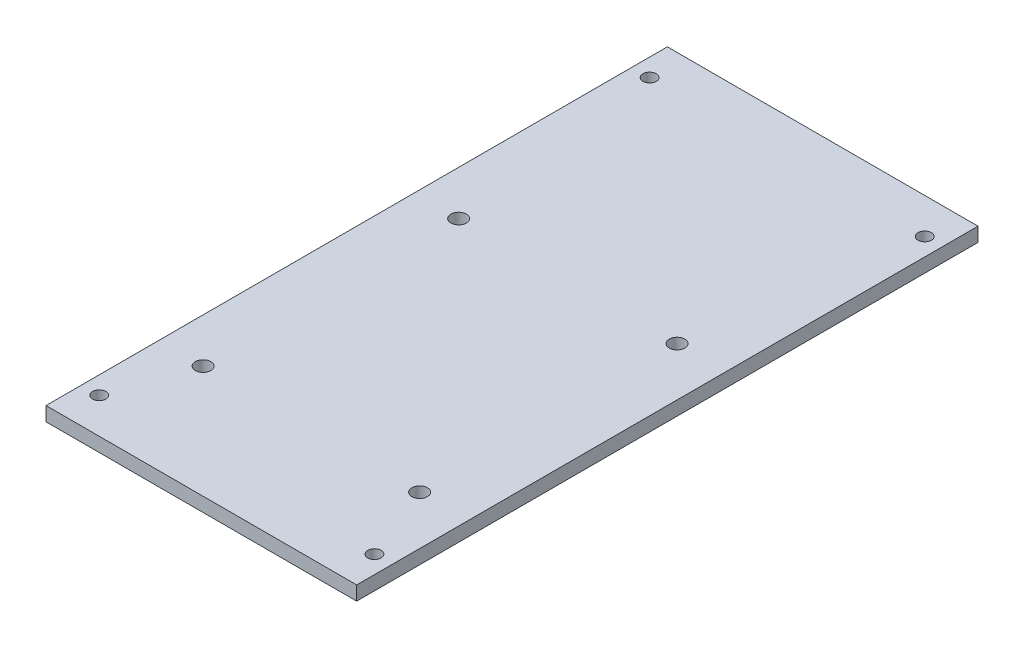
ISO-10303-21;
HEADER;
FILE_DESCRIPTION(('STEP AP214'),'2;1');
FILE_NAME('part.step','',(''),(''),'','','');
FILE_SCHEMA(('AUTOMOTIVE_DESIGN { 1 0 10303 214 1 1 1 1 }'));
ENDSEC;
DATA;
#1=APPLICATION_CONTEXT('core data for automotive mechanical design processes');
#2=APPLICATION_PROTOCOL_DEFINITION('international standard','automotive_design',2000,#1);
#3=PRODUCT_CONTEXT('',#1,'mechanical');
#4=PRODUCT('Part','Part','',(#3));
#5=PRODUCT_RELATED_PRODUCT_CATEGORY('part','',(#4));
#6=PRODUCT_DEFINITION_FORMATION('','',#4);
#7=PRODUCT_DEFINITION_CONTEXT('part definition',#1,'design');
#8=PRODUCT_DEFINITION('design','',#6,#7);
#9=PRODUCT_DEFINITION_SHAPE('','',#8);
#10=(LENGTH_UNIT() NAMED_UNIT(*) SI_UNIT(.MILLI.,.METRE.));
#11=(NAMED_UNIT(*) PLANE_ANGLE_UNIT() SI_UNIT($,.RADIAN.));
#12=(NAMED_UNIT(*) SI_UNIT($,.STERADIAN.) SOLID_ANGLE_UNIT());
#13=UNCERTAINTY_MEASURE_WITH_UNIT(LENGTH_MEASURE(1.E-05),#10,'distance_accuracy_value','');
#14=(GEOMETRIC_REPRESENTATION_CONTEXT(3) GLOBAL_UNCERTAINTY_ASSIGNED_CONTEXT((#13)) GLOBAL_UNIT_ASSIGNED_CONTEXT((#10,
#11,#12)) REPRESENTATION_CONTEXT('',''));
#15=CARTESIAN_POINT('',(0.,0.,0.));
#16=DIRECTION('',(0.,0.,1.));
#17=DIRECTION('',(1.,0.,0.));
#18=AXIS2_PLACEMENT_3D('',#15,#16,#17);
#19=CARTESIAN_POINT('',(0.,3.175,0.));
#20=DIRECTION('',(0.,1.,0.));
#21=DIRECTION('',(0.,0.,1.));
#22=AXIS2_PLACEMENT_3D('',#19,#20,#21);
#23=PLANE('',#22);
#24=CARTESIAN_POINT('',(-24.999549752776,3.175,-12.9798856097353));
#25=DIRECTION('',(0.,1.,0.));
#26=DIRECTION('',(0.,0.,-1.));
#27=AXIS2_PLACEMENT_3D('',#24,#25,#26);
#28=CIRCLE('',#27,1.75);
#29=CARTESIAN_POINT('',(-24.999549752776,3.175,-14.7298856097353));
#30=VERTEX_POINT('',#29);
#31=EDGE_CURVE('E154',#30,#30,#28,.T.);
#32=ORIENTED_EDGE('',*,*,#31,.F.);
#33=EDGE_LOOP('',(#32));
#34=FACE_BOUND('',#33,.T.);
#35=CARTESIAN_POINT('',(24.,3.175,-13.1899428048677));
#36=DIRECTION('',(0.,1.,0.));
#37=DIRECTION('',(0.,0.,-1.));
#38=AXIS2_PLACEMENT_3D('',#35,#36,#37);
#39=CIRCLE('',#38,1.75);
#40=CARTESIAN_POINT('',(24.,3.175,-14.9399428048677));
#41=VERTEX_POINT('',#40);
#42=EDGE_CURVE('E148',#41,#41,#39,.T.);
#43=ORIENTED_EDGE('',*,*,#42,.F.);
#44=EDGE_LOOP('',(#43));
#45=FACE_BOUND('',#44,.T.);
#46=CARTESIAN_POINT('',(24.,3.175,44.8100571951323));
#47=DIRECTION('',(0.,1.,0.));
#48=DIRECTION('',(0.,0.,1.));
#49=AXIS2_PLACEMENT_3D('',#46,#47,#48);
#50=CIRCLE('',#49,1.75);
#51=CARTESIAN_POINT('',(24.,3.175,46.5600571951323));
#52=VERTEX_POINT('',#51);
#53=EDGE_CURVE('E142',#52,#52,#50,.T.);
#54=ORIENTED_EDGE('',*,*,#53,.F.);
#55=EDGE_LOOP('',(#54));
#56=FACE_BOUND('',#55,.T.);
#57=CARTESIAN_POINT('',(-24.999549752776,3.175,44.6));
#58=DIRECTION('',(0.,1.,0.));
#59=DIRECTION('',(0.,0.,1.));
#60=AXIS2_PLACEMENT_3D('',#57,#58,#59);
#61=CIRCLE('',#60,1.75);
#62=CARTESIAN_POINT('',(-24.999549752776,3.175,46.35));
#63=VERTEX_POINT('',#62);
#64=EDGE_CURVE('E136',#63,#63,#61,.T.);
#65=ORIENTED_EDGE('',*,*,#64,.F.);
#66=EDGE_LOOP('',(#65));
#67=FACE_BOUND('',#66,.T.);
#68=CARTESIAN_POINT('',(-31.,3.175,-62.));
#69=DIRECTION('',(0.,1.,0.));
#70=DIRECTION('',(0.,0.,1.));
#71=AXIS2_PLACEMENT_3D('',#68,#69,#70);
#72=CIRCLE('',#71,1.5);
#73=CARTESIAN_POINT('',(-31.,3.175,-60.5));
#74=VERTEX_POINT('',#73);
#75=EDGE_CURVE('E121',#74,#74,#72,.T.);
#76=ORIENTED_EDGE('',*,*,#75,.F.);
#77=EDGE_LOOP('',(#76));
#78=FACE_BOUND('',#77,.T.);
#79=CARTESIAN_POINT('',(31.,3.175,62.));
#80=DIRECTION('',(0.,1.,0.));
#81=DIRECTION('',(0.,0.,1.));
#82=AXIS2_PLACEMENT_3D('',#79,#80,#81);
#83=CIRCLE('',#82,1.50000000000001);
#84=CARTESIAN_POINT('',(31.,3.175,63.5));
#85=VERTEX_POINT('',#84);
#86=EDGE_CURVE('E100',#85,#85,#83,.T.);
#87=ORIENTED_EDGE('',*,*,#86,.F.);
#88=EDGE_LOOP('',(#87));
#89=FACE_BOUND('',#88,.T.);
#90=DIRECTION('',(0.,0.,1.));
#91=VECTOR('',#90,1.);
#92=CARTESIAN_POINT('',(-35.,3.175,70.));
#93=LINE('',#92,#91);
#94=CARTESIAN_POINT('',(-35.,3.175,-70.));
#95=VERTEX_POINT('',#94);
#96=CARTESIAN_POINT('',(-35.,3.175,70.));
#97=VERTEX_POINT('',#96);
#98=EDGE_CURVE('E85',#95,#97,#93,.T.);
#99=ORIENTED_EDGE('',*,*,#98,.T.);
#100=DIRECTION('',(1.,0.,0.));
#101=VECTOR('',#100,1.);
#102=CARTESIAN_POINT('',(35.,3.175,70.));
#103=LINE('',#102,#101);
#104=CARTESIAN_POINT('',(35.,3.175,70.));
#105=VERTEX_POINT('',#104);
#106=EDGE_CURVE('E80',#97,#105,#103,.T.);
#107=ORIENTED_EDGE('',*,*,#106,.T.);
#108=DIRECTION('',(0.,0.,-1.));
#109=VECTOR('',#108,1.);
#110=CARTESIAN_POINT('',(35.,3.175,70.));
#111=LINE('',#110,#109);
#112=CARTESIAN_POINT('',(35.,3.175,-70.));
#113=VERTEX_POINT('',#112);
#114=EDGE_CURVE('E83',#105,#113,#111,.T.);
#115=ORIENTED_EDGE('',*,*,#114,.T.);
#116=DIRECTION('',(-1.,0.,0.));
#117=VECTOR('',#116,1.);
#118=CARTESIAN_POINT('',(35.,3.175,-70.));
#119=LINE('',#118,#117);
#120=EDGE_CURVE('E50',#113,#95,#119,.T.);
#121=ORIENTED_EDGE('',*,*,#120,.T.);
#122=EDGE_LOOP('',(#99,#107,#115,#121));
#123=FACE_BOUND('',#122,.T.);
#124=CARTESIAN_POINT('',(31.,3.175,-62.));
#125=DIRECTION('',(0.,1.,0.));
#126=DIRECTION('',(0.,0.,-1.));
#127=AXIS2_PLACEMENT_3D('',#124,#125,#126);
#128=CIRCLE('',#127,1.50000000000001);
#129=CARTESIAN_POINT('',(31.,3.175,-63.5));
#130=VERTEX_POINT('',#129);
#131=EDGE_CURVE('E115',#130,#130,#128,.T.);
#132=ORIENTED_EDGE('',*,*,#131,.F.);
#133=EDGE_LOOP('',(#132));
#134=FACE_BOUND('',#133,.T.);
#135=CARTESIAN_POINT('',(-31.,3.175,62.));
#136=DIRECTION('',(0.,1.,0.));
#137=DIRECTION('',(0.,0.,-1.));
#138=AXIS2_PLACEMENT_3D('',#135,#136,#137);
#139=CIRCLE('',#138,1.5);
#140=CARTESIAN_POINT('',(-31.,3.175,60.5));
#141=VERTEX_POINT('',#140);
#142=EDGE_CURVE('E127',#141,#141,#139,.T.);
#143=ORIENTED_EDGE('',*,*,#142,.F.);
#144=EDGE_LOOP('',(#143));
#145=FACE_BOUND('',#144,.T.);
#146=ADVANCED_FACE('F33',(#34,#45,#56,#67,#78,#89,#123,#134,#145),#23,.T.);
#147=CARTESIAN_POINT('',(0.,0.,0.));
#148=DIRECTION('',(0.,1.,0.));
#149=DIRECTION('',(0.,0.,1.));
#150=AXIS2_PLACEMENT_3D('',#147,#148,#149);
#151=PLANE('',#150);
#152=CARTESIAN_POINT('',(-24.999549752776,0.,-12.9798856097353));
#153=DIRECTION('',(0.,1.,0.));
#154=DIRECTION('',(0.,0.,-1.));
#155=AXIS2_PLACEMENT_3D('',#152,#153,#154);
#156=CIRCLE('',#155,1.75);
#157=CARTESIAN_POINT('',(-24.999549752776,0.,-14.7298856097353));
#158=VERTEX_POINT('',#157);
#159=EDGE_CURVE('E151',#158,#158,#156,.T.);
#160=ORIENTED_EDGE('',*,*,#159,.T.);
#161=EDGE_LOOP('',(#160));
#162=FACE_BOUND('',#161,.T.);
#163=CARTESIAN_POINT('',(24.,0.,-13.1899428048677));
#164=DIRECTION('',(0.,1.,0.));
#165=DIRECTION('',(0.,0.,-1.));
#166=AXIS2_PLACEMENT_3D('',#163,#164,#165);
#167=CIRCLE('',#166,1.75);
#168=CARTESIAN_POINT('',(24.,0.,-14.9399428048677));
#169=VERTEX_POINT('',#168);
#170=EDGE_CURVE('E145',#169,#169,#167,.T.);
#171=ORIENTED_EDGE('',*,*,#170,.T.);
#172=EDGE_LOOP('',(#171));
#173=FACE_BOUND('',#172,.T.);
#174=CARTESIAN_POINT('',(24.,0.,44.8100571951323));
#175=DIRECTION('',(0.,1.,0.));
#176=DIRECTION('',(0.,0.,1.));
#177=AXIS2_PLACEMENT_3D('',#174,#175,#176);
#178=CIRCLE('',#177,1.75);
#179=CARTESIAN_POINT('',(24.,0.,46.5600571951323));
#180=VERTEX_POINT('',#179);
#181=EDGE_CURVE('E139',#180,#180,#178,.T.);
#182=ORIENTED_EDGE('',*,*,#181,.T.);
#183=EDGE_LOOP('',(#182));
#184=FACE_BOUND('',#183,.T.);
#185=CARTESIAN_POINT('',(-24.999549752776,0.,44.6));
#186=DIRECTION('',(0.,1.,0.));
#187=DIRECTION('',(0.,0.,1.));
#188=AXIS2_PLACEMENT_3D('',#185,#186,#187);
#189=CIRCLE('',#188,1.75);
#190=CARTESIAN_POINT('',(-24.999549752776,0.,46.35));
#191=VERTEX_POINT('',#190);
#192=EDGE_CURVE('E133',#191,#191,#189,.T.);
#193=ORIENTED_EDGE('',*,*,#192,.T.);
#194=EDGE_LOOP('',(#193));
#195=FACE_BOUND('',#194,.T.);
#196=CARTESIAN_POINT('',(-31.,0.,-62.));
#197=DIRECTION('',(0.,1.,0.));
#198=DIRECTION('',(0.,0.,1.));
#199=AXIS2_PLACEMENT_3D('',#196,#197,#198);
#200=CIRCLE('',#199,1.5);
#201=CARTESIAN_POINT('',(-31.,0.,-60.5));
#202=VERTEX_POINT('',#201);
#203=EDGE_CURVE('E124',#202,#202,#200,.T.);
#204=ORIENTED_EDGE('',*,*,#203,.T.);
#205=EDGE_LOOP('',(#204));
#206=FACE_BOUND('',#205,.T.);
#207=CARTESIAN_POINT('',(31.,0.,62.));
#208=DIRECTION('',(0.,1.,0.));
#209=DIRECTION('',(0.,0.,1.));
#210=AXIS2_PLACEMENT_3D('',#207,#208,#209);
#211=CIRCLE('',#210,1.50000000000001);
#212=CARTESIAN_POINT('',(31.,0.,63.5));
#213=VERTEX_POINT('',#212);
#214=EDGE_CURVE('E112',#213,#213,#211,.T.);
#215=ORIENTED_EDGE('',*,*,#214,.T.);
#216=EDGE_LOOP('',(#215));
#217=FACE_BOUND('',#216,.T.);
#218=DIRECTION('',(0.,0.,1.));
#219=VECTOR('',#218,1.);
#220=CARTESIAN_POINT('',(-35.,0.,70.));
#221=LINE('',#220,#219);
#222=CARTESIAN_POINT('',(-35.,0.,-70.));
#223=VERTEX_POINT('',#222);
#224=CARTESIAN_POINT('',(-35.,0.,70.));
#225=VERTEX_POINT('',#224);
#226=EDGE_CURVE('E97',#223,#225,#221,.T.);
#227=ORIENTED_EDGE('',*,*,#226,.F.);
#228=DIRECTION('',(-1.,0.,0.));
#229=VECTOR('',#228,1.);
#230=CARTESIAN_POINT('',(35.,0.,-70.));
#231=LINE('',#230,#229);
#232=CARTESIAN_POINT('',(35.,0.,-70.));
#233=VERTEX_POINT('',#232);
#234=EDGE_CURVE('E73',#233,#223,#231,.T.);
#235=ORIENTED_EDGE('',*,*,#234,.F.);
#236=DIRECTION('',(0.,0.,-1.));
#237=VECTOR('',#236,1.);
#238=CARTESIAN_POINT('',(35.,0.,70.));
#239=LINE('',#238,#237);
#240=CARTESIAN_POINT('',(35.,0.,70.));
#241=VERTEX_POINT('',#240);
#242=EDGE_CURVE('E67',#241,#233,#239,.T.);
#243=ORIENTED_EDGE('',*,*,#242,.F.);
#244=DIRECTION('',(1.,0.,0.));
#245=VECTOR('',#244,1.);
#246=CARTESIAN_POINT('',(35.,0.,70.));
#247=LINE('',#246,#245);
#248=EDGE_CURVE('E89',#225,#241,#247,.T.);
#249=ORIENTED_EDGE('',*,*,#248,.F.);
#250=EDGE_LOOP('',(#227,#235,#243,#249));
#251=FACE_BOUND('',#250,.T.);
#252=CARTESIAN_POINT('',(31.,0.,-62.));
#253=DIRECTION('',(0.,1.,0.));
#254=DIRECTION('',(0.,0.,-1.));
#255=AXIS2_PLACEMENT_3D('',#252,#253,#254);
#256=CIRCLE('',#255,1.50000000000001);
#257=CARTESIAN_POINT('',(31.,0.,-63.5));
#258=VERTEX_POINT('',#257);
#259=EDGE_CURVE('E118',#258,#258,#256,.T.);
#260=ORIENTED_EDGE('',*,*,#259,.T.);
#261=EDGE_LOOP('',(#260));
#262=FACE_BOUND('',#261,.T.);
#263=CARTESIAN_POINT('',(-31.,0.,62.));
#264=DIRECTION('',(0.,1.,0.));
#265=DIRECTION('',(0.,0.,-1.));
#266=AXIS2_PLACEMENT_3D('',#263,#264,#265);
#267=CIRCLE('',#266,1.5);
#268=CARTESIAN_POINT('',(-31.,0.,60.5));
#269=VERTEX_POINT('',#268);
#270=EDGE_CURVE('E130',#269,#269,#267,.T.);
#271=ORIENTED_EDGE('',*,*,#270,.T.);
#272=EDGE_LOOP('',(#271));
#273=FACE_BOUND('',#272,.T.);
#274=ADVANCED_FACE('F108',(#162,#173,#184,#195,#206,#217,#251,#262,#273),#151,.F.);
#275=CARTESIAN_POINT('',(-35.,3.175,70.));
#276=DIRECTION('',(1.,0.,0.));
#277=DIRECTION('',(0.,0.,-1.));
#278=AXIS2_PLACEMENT_3D('',#275,#276,#277);
#279=PLANE('',#278);
#280=ORIENTED_EDGE('',*,*,#226,.T.);
#281=DIRECTION('',(0.,-1.,0.));
#282=VECTOR('',#281,1.);
#283=CARTESIAN_POINT('',(-35.,3.175,70.));
#284=LINE('',#283,#282);
#285=EDGE_CURVE('E11',#97,#225,#284,.T.);
#286=ORIENTED_EDGE('',*,*,#285,.F.);
#287=ORIENTED_EDGE('',*,*,#98,.F.);
#288=DIRECTION('',(0.,-1.,0.));
#289=VECTOR('',#288,1.);
#290=CARTESIAN_POINT('',(-35.,3.175,-70.));
#291=LINE('',#290,#289);
#292=EDGE_CURVE('E93',#95,#223,#291,.T.);
#293=ORIENTED_EDGE('',*,*,#292,.T.);
#294=EDGE_LOOP('',(#280,#286,#287,#293));
#295=FACE_BOUND('',#294,.T.);
#296=ADVANCED_FACE('F35',(#295),#279,.F.);
#297=CARTESIAN_POINT('',(35.,3.175,70.));
#298=DIRECTION('',(0.,0.,-1.));
#299=DIRECTION('',(-1.,0.,0.));
#300=AXIS2_PLACEMENT_3D('',#297,#298,#299);
#301=PLANE('',#300);
#302=ORIENTED_EDGE('',*,*,#248,.T.);
#303=DIRECTION('',(0.,-1.,0.));
#304=VECTOR('',#303,1.);
#305=CARTESIAN_POINT('',(35.,3.175,70.));
#306=LINE('',#305,#304);
#307=EDGE_CURVE('E42',#105,#241,#306,.T.);
#308=ORIENTED_EDGE('',*,*,#307,.F.);
#309=ORIENTED_EDGE('',*,*,#106,.F.);
#310=ORIENTED_EDGE('',*,*,#285,.T.);
#311=EDGE_LOOP('',(#302,#308,#309,#310));
#312=FACE_BOUND('',#311,.T.);
#313=ADVANCED_FACE('F88',(#312),#301,.F.);
#314=CARTESIAN_POINT('',(35.,3.175,70.));
#315=DIRECTION('',(-1.,0.,0.));
#316=DIRECTION('',(0.,0.,1.));
#317=AXIS2_PLACEMENT_3D('',#314,#315,#316);
#318=PLANE('',#317);
#319=ORIENTED_EDGE('',*,*,#242,.T.);
#320=DIRECTION('',(0.,-1.,0.));
#321=VECTOR('',#320,1.);
#322=CARTESIAN_POINT('',(35.,3.175,-70.));
#323=LINE('',#322,#321);
#324=EDGE_CURVE('E90',#113,#233,#323,.T.);
#325=ORIENTED_EDGE('',*,*,#324,.F.);
#326=ORIENTED_EDGE('',*,*,#114,.F.);
#327=ORIENTED_EDGE('',*,*,#307,.T.);
#328=EDGE_LOOP('',(#319,#325,#326,#327));
#329=FACE_BOUND('',#328,.T.);
#330=ADVANCED_FACE('F91',(#329),#318,.F.);
#331=CARTESIAN_POINT('',(35.,3.175,-70.));
#332=DIRECTION('',(0.,0.,1.));
#333=DIRECTION('',(1.,0.,0.));
#334=AXIS2_PLACEMENT_3D('',#331,#332,#333);
#335=PLANE('',#334);
#336=ORIENTED_EDGE('',*,*,#234,.T.);
#337=ORIENTED_EDGE('',*,*,#292,.F.);
#338=ORIENTED_EDGE('',*,*,#120,.F.);
#339=ORIENTED_EDGE('',*,*,#324,.T.);
#340=EDGE_LOOP('',(#336,#337,#338,#339));
#341=FACE_BOUND('',#340,.T.);
#342=ADVANCED_FACE('F105',(#341),#335,.F.);
#343=CARTESIAN_POINT('',(31.,3.175,62.));
#344=DIRECTION('',(0.,-1.,0.));
#345=DIRECTION('',(0.,0.,-1.));
#346=AXIS2_PLACEMENT_3D('',#343,#344,#345);
#347=CYLINDRICAL_SURFACE('',#346,1.50000000000001);
#348=ORIENTED_EDGE('',*,*,#86,.T.);
#349=EDGE_LOOP('',(#348));
#350=FACE_BOUND('',#349,.T.);
#351=ORIENTED_EDGE('',*,*,#214,.F.);
#352=EDGE_LOOP('',(#351));
#353=FACE_BOUND('',#352,.T.);
#354=ADVANCED_FACE('F182',(#350,#353),#347,.F.);
#355=CARTESIAN_POINT('',(31.,3.175,-62.));
#356=DIRECTION('',(0.,-1.,0.));
#357=DIRECTION('',(0.,0.,-1.));
#358=AXIS2_PLACEMENT_3D('',#355,#356,#357);
#359=CYLINDRICAL_SURFACE('',#358,1.50000000000001);
#360=ORIENTED_EDGE('',*,*,#131,.T.);
#361=EDGE_LOOP('',(#360));
#362=FACE_BOUND('',#361,.T.);
#363=ORIENTED_EDGE('',*,*,#259,.F.);
#364=EDGE_LOOP('',(#363));
#365=FACE_BOUND('',#364,.T.);
#366=ADVANCED_FACE('F185',(#362,#365),#359,.F.);
#367=CARTESIAN_POINT('',(-31.,3.175,-62.));
#368=DIRECTION('',(0.,-1.,0.));
#369=DIRECTION('',(0.,0.,-1.));
#370=AXIS2_PLACEMENT_3D('',#367,#368,#369);
#371=CYLINDRICAL_SURFACE('',#370,1.5);
#372=ORIENTED_EDGE('',*,*,#75,.T.);
#373=EDGE_LOOP('',(#372));
#374=FACE_BOUND('',#373,.T.);
#375=ORIENTED_EDGE('',*,*,#203,.F.);
#376=EDGE_LOOP('',(#375));
#377=FACE_BOUND('',#376,.T.);
#378=ADVANCED_FACE('F222',(#374,#377),#371,.F.);
#379=CARTESIAN_POINT('',(-31.,3.175,62.));
#380=DIRECTION('',(0.,-1.,0.));
#381=DIRECTION('',(0.,0.,-1.));
#382=AXIS2_PLACEMENT_3D('',#379,#380,#381);
#383=CYLINDRICAL_SURFACE('',#382,1.5);
#384=ORIENTED_EDGE('',*,*,#142,.T.);
#385=EDGE_LOOP('',(#384));
#386=FACE_BOUND('',#385,.T.);
#387=ORIENTED_EDGE('',*,*,#270,.F.);
#388=EDGE_LOOP('',(#387));
#389=FACE_BOUND('',#388,.T.);
#390=ADVANCED_FACE('F230',(#386,#389),#383,.F.);
#391=CARTESIAN_POINT('',(-24.999549752776,0.,44.6));
#392=DIRECTION('',(0.,1.,0.));
#393=DIRECTION('',(0.,0.,1.));
#394=AXIS2_PLACEMENT_3D('',#391,#392,#393);
#395=CYLINDRICAL_SURFACE('',#394,1.75);
#396=ORIENTED_EDGE('',*,*,#192,.F.);
#397=EDGE_LOOP('',(#396));
#398=FACE_BOUND('',#397,.T.);
#399=ORIENTED_EDGE('',*,*,#64,.T.);
#400=EDGE_LOOP('',(#399));
#401=FACE_BOUND('',#400,.T.);
#402=ADVANCED_FACE('F238',(#398,#401),#395,.F.);
#403=CARTESIAN_POINT('',(24.,0.,44.8100571951323));
#404=DIRECTION('',(0.,1.,0.));
#405=DIRECTION('',(0.,0.,1.));
#406=AXIS2_PLACEMENT_3D('',#403,#404,#405);
#407=CYLINDRICAL_SURFACE('',#406,1.75);
#408=ORIENTED_EDGE('',*,*,#181,.F.);
#409=EDGE_LOOP('',(#408));
#410=FACE_BOUND('',#409,.T.);
#411=ORIENTED_EDGE('',*,*,#53,.T.);
#412=EDGE_LOOP('',(#411));
#413=FACE_BOUND('',#412,.T.);
#414=ADVANCED_FACE('F245',(#410,#413),#407,.F.);
#415=CARTESIAN_POINT('',(24.,0.,-13.1899428048677));
#416=DIRECTION('',(0.,1.,0.));
#417=DIRECTION('',(0.,0.,1.));
#418=AXIS2_PLACEMENT_3D('',#415,#416,#417);
#419=CYLINDRICAL_SURFACE('',#418,1.75);
#420=ORIENTED_EDGE('',*,*,#170,.F.);
#421=EDGE_LOOP('',(#420));
#422=FACE_BOUND('',#421,.T.);
#423=ORIENTED_EDGE('',*,*,#42,.T.);
#424=EDGE_LOOP('',(#423));
#425=FACE_BOUND('',#424,.T.);
#426=ADVANCED_FACE('F165',(#422,#425),#419,.F.);
#427=CARTESIAN_POINT('',(-24.999549752776,0.,-12.9798856097353));
#428=DIRECTION('',(0.,1.,0.));
#429=DIRECTION('',(0.,0.,1.));
#430=AXIS2_PLACEMENT_3D('',#427,#428,#429);
#431=CYLINDRICAL_SURFACE('',#430,1.75);
#432=ORIENTED_EDGE('',*,*,#159,.F.);
#433=EDGE_LOOP('',(#432));
#434=FACE_BOUND('',#433,.T.);
#435=ORIENTED_EDGE('',*,*,#31,.T.);
#436=EDGE_LOOP('',(#435));
#437=FACE_BOUND('',#436,.T.);
#438=ADVANCED_FACE('F162',(#434,#437),#431,.F.);
#439=CLOSED_SHELL('',(#146,#274,#296,#313,#330,#342,#354,#366,#378,#390,#402,#414,#426,#438));
#440=MANIFOLD_SOLID_BREP('B2',#439);
#441=ADVANCED_BREP_SHAPE_REPRESENTATION('',(#18,#440),#14);
#442=SHAPE_DEFINITION_REPRESENTATION(#9,#441);
ENDSEC;
END-ISO-10303-21;
